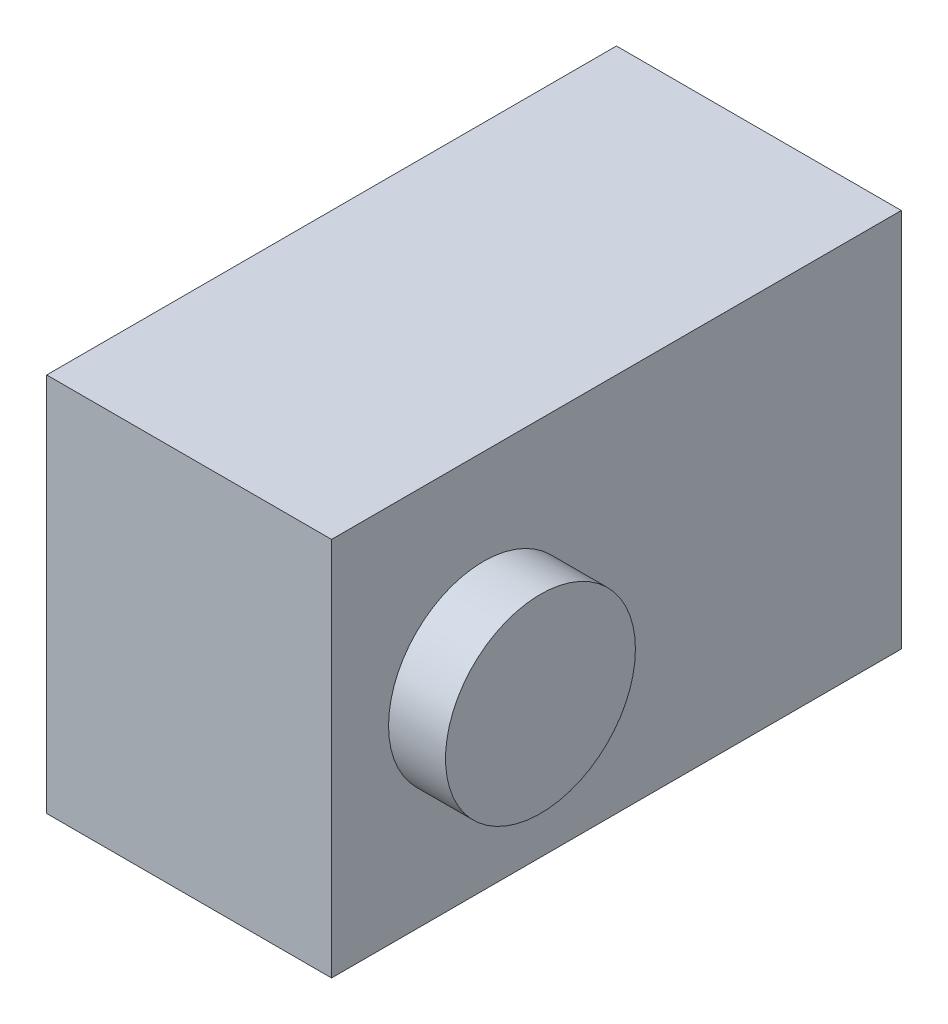
ISO-10303-21;
HEADER;
FILE_DESCRIPTION(('STEP AP214'),'2;1');
FILE_NAME('part.step','',(''),(''),'','','');
FILE_SCHEMA(('AUTOMOTIVE_DESIGN { 1 0 10303 214 1 1 1 1 }'));
ENDSEC;
DATA;
#1=APPLICATION_CONTEXT('core data for automotive mechanical design processes');
#2=APPLICATION_PROTOCOL_DEFINITION('international standard','automotive_design',2000,#1);
#3=PRODUCT_CONTEXT('',#1,'mechanical');
#4=PRODUCT('Part','Part','',(#3));
#5=PRODUCT_RELATED_PRODUCT_CATEGORY('part','',(#4));
#6=PRODUCT_DEFINITION_FORMATION('','',#4);
#7=PRODUCT_DEFINITION_CONTEXT('part definition',#1,'design');
#8=PRODUCT_DEFINITION('design','',#6,#7);
#9=PRODUCT_DEFINITION_SHAPE('','',#8);
#10=(LENGTH_UNIT() NAMED_UNIT(*) SI_UNIT(.MILLI.,.METRE.));
#11=(NAMED_UNIT(*) PLANE_ANGLE_UNIT() SI_UNIT($,.RADIAN.));
#12=(NAMED_UNIT(*) SI_UNIT($,.STERADIAN.) SOLID_ANGLE_UNIT());
#13=UNCERTAINTY_MEASURE_WITH_UNIT(LENGTH_MEASURE(1.E-05),#10,'distance_accuracy_value','');
#14=(GEOMETRIC_REPRESENTATION_CONTEXT(3) GLOBAL_UNCERTAINTY_ASSIGNED_CONTEXT((#13)) GLOBAL_UNIT_ASSIGNED_CONTEXT((#10,
#11,#12)) REPRESENTATION_CONTEXT('',''));
#15=CARTESIAN_POINT('',(0.,0.,0.));
#16=DIRECTION('',(0.,0.,1.));
#17=DIRECTION('',(1.,0.,0.));
#18=AXIS2_PLACEMENT_3D('',#15,#16,#17);
#19=CARTESIAN_POINT('',(3.,0.,30.));
#20=DIRECTION('',(1.,0.,0.));
#21=DIRECTION('',(0.,0.,-1.));
#22=AXIS2_PLACEMENT_3D('',#19,#20,#21);
#23=PLANE('',#22);
#24=CARTESIAN_POINT('',(3.,10.,22.));
#25=DIRECTION('',(1.,0.,0.));
#26=DIRECTION('',(0.,0.,-1.));
#27=AXIS2_PLACEMENT_3D('',#24,#25,#26);
#28=CIRCLE('',#27,5.);
#29=CARTESIAN_POINT('',(3.,10.,17.));
#30=VERTEX_POINT('',#29);
#31=EDGE_CURVE('E106',#30,#30,#28,.T.);
#32=ORIENTED_EDGE('',*,*,#31,.T.);
#33=EDGE_LOOP('',(#32));
#34=FACE_BOUND('',#33,.T.);
#35=DIRECTION('',(0.,-1.,0.));
#36=VECTOR('',#35,1.);
#37=CARTESIAN_POINT('',(3.,0.,0.));
#38=LINE('',#37,#36);
#39=CARTESIAN_POINT('',(3.,20.,0.));
#40=VERTEX_POINT('',#39);
#41=CARTESIAN_POINT('',(3.,0.,0.));
#42=VERTEX_POINT('',#41);
#43=EDGE_CURVE('E103',#40,#42,#38,.T.);
#44=ORIENTED_EDGE('',*,*,#43,.T.);
#45=DIRECTION('',(0.,0.,-1.));
#46=VECTOR('',#45,1.);
#47=CARTESIAN_POINT('',(3.,0.,30.));
#48=LINE('',#47,#46);
#49=CARTESIAN_POINT('',(3.,0.,30.));
#50=VERTEX_POINT('',#49);
#51=EDGE_CURVE('E11',#50,#42,#48,.T.);
#52=ORIENTED_EDGE('',*,*,#51,.F.);
#53=DIRECTION('',(0.,-1.,0.));
#54=VECTOR('',#53,1.);
#55=CARTESIAN_POINT('',(3.,0.,30.));
#56=LINE('',#55,#54);
#57=CARTESIAN_POINT('',(3.,20.,30.));
#58=VERTEX_POINT('',#57);
#59=EDGE_CURVE('E90',#58,#50,#56,.T.);
#60=ORIENTED_EDGE('',*,*,#59,.F.);
#61=DIRECTION('',(0.,0.,-1.));
#62=VECTOR('',#61,1.);
#63=CARTESIAN_POINT('',(3.,20.,30.));
#64=LINE('',#63,#62);
#65=EDGE_CURVE('E99',#58,#40,#64,.T.);
#66=ORIENTED_EDGE('',*,*,#65,.T.);
#67=EDGE_LOOP('',(#44,#52,#60,#66));
#68=FACE_BOUND('',#67,.T.);
#69=ADVANCED_FACE('F38',(#34,#68),#23,.F.);
#70=CARTESIAN_POINT('',(3.,0.,30.));
#71=DIRECTION('',(0.,1.,0.));
#72=DIRECTION('',(0.,0.,1.));
#73=AXIS2_PLACEMENT_3D('',#70,#71,#72);
#74=PLANE('',#73);
#75=DIRECTION('',(1.,0.,0.));
#76=VECTOR('',#75,1.);
#77=CARTESIAN_POINT('',(3.,0.,0.));
#78=LINE('',#77,#76);
#79=CARTESIAN_POINT('',(18.,0.,0.));
#80=VERTEX_POINT('',#79);
#81=EDGE_CURVE('E94',#42,#80,#78,.T.);
#82=ORIENTED_EDGE('',*,*,#81,.T.);
#83=DIRECTION('',(0.,0.,-1.));
#84=VECTOR('',#83,1.);
#85=CARTESIAN_POINT('',(18.,0.,30.));
#86=LINE('',#85,#84);
#87=CARTESIAN_POINT('',(18.,0.,30.));
#88=VERTEX_POINT('',#87);
#89=EDGE_CURVE('E47',#88,#80,#86,.T.);
#90=ORIENTED_EDGE('',*,*,#89,.F.);
#91=DIRECTION('',(1.,0.,0.));
#92=VECTOR('',#91,1.);
#93=CARTESIAN_POINT('',(3.,0.,30.));
#94=LINE('',#93,#92);
#95=EDGE_CURVE('E85',#50,#88,#94,.T.);
#96=ORIENTED_EDGE('',*,*,#95,.F.);
#97=ORIENTED_EDGE('',*,*,#51,.T.);
#98=EDGE_LOOP('',(#82,#90,#96,#97));
#99=FACE_BOUND('',#98,.T.);
#100=ADVANCED_FACE('F93',(#99),#74,.F.);
#101=CARTESIAN_POINT('',(18.,0.,30.));
#102=DIRECTION('',(-1.,0.,0.));
#103=DIRECTION('',(0.,0.,1.));
#104=AXIS2_PLACEMENT_3D('',#101,#102,#103);
#105=PLANE('',#104);
#106=CARTESIAN_POINT('',(18.,10.,22.));
#107=DIRECTION('',(-1.,0.,0.));
#108=DIRECTION('',(0.,0.,1.));
#109=AXIS2_PLACEMENT_3D('',#106,#107,#108);
#110=CIRCLE('',#109,5.);
#111=CARTESIAN_POINT('',(18.,10.,27.));
#112=VERTEX_POINT('',#111);
#113=EDGE_CURVE('E41',#112,#112,#110,.T.);
#114=ORIENTED_EDGE('',*,*,#113,.T.);
#115=EDGE_LOOP('',(#114));
#116=FACE_BOUND('',#115,.T.);
#117=DIRECTION('',(0.,1.,0.));
#118=VECTOR('',#117,1.);
#119=CARTESIAN_POINT('',(18.,0.,0.));
#120=LINE('',#119,#118);
#121=CARTESIAN_POINT('',(18.,20.,0.));
#122=VERTEX_POINT('',#121);
#123=EDGE_CURVE('E72',#80,#122,#120,.T.);
#124=ORIENTED_EDGE('',*,*,#123,.T.);
#125=DIRECTION('',(0.,0.,-1.));
#126=VECTOR('',#125,1.);
#127=CARTESIAN_POINT('',(18.,20.,30.));
#128=LINE('',#127,#126);
#129=CARTESIAN_POINT('',(18.,20.,30.));
#130=VERTEX_POINT('',#129);
#131=EDGE_CURVE('E95',#130,#122,#128,.T.);
#132=ORIENTED_EDGE('',*,*,#131,.F.);
#133=DIRECTION('',(0.,1.,0.));
#134=VECTOR('',#133,1.);
#135=CARTESIAN_POINT('',(18.,0.,30.));
#136=LINE('',#135,#134);
#137=EDGE_CURVE('E88',#88,#130,#136,.T.);
#138=ORIENTED_EDGE('',*,*,#137,.F.);
#139=ORIENTED_EDGE('',*,*,#89,.T.);
#140=EDGE_LOOP('',(#124,#132,#138,#139));
#141=FACE_BOUND('',#140,.T.);
#142=ADVANCED_FACE('F97',(#116,#141),#105,.F.);
#143=CARTESIAN_POINT('',(3.,20.,30.));
#144=DIRECTION('',(0.,-1.,0.));
#145=DIRECTION('',(0.,0.,-1.));
#146=AXIS2_PLACEMENT_3D('',#143,#144,#145);
#147=PLANE('',#146);
#148=DIRECTION('',(-1.,0.,0.));
#149=VECTOR('',#148,1.);
#150=CARTESIAN_POINT('',(3.,20.,0.));
#151=LINE('',#150,#149);
#152=EDGE_CURVE('E78',#122,#40,#151,.T.);
#153=ORIENTED_EDGE('',*,*,#152,.T.);
#154=ORIENTED_EDGE('',*,*,#65,.F.);
#155=DIRECTION('',(-1.,0.,0.));
#156=VECTOR('',#155,1.);
#157=CARTESIAN_POINT('',(3.,20.,30.));
#158=LINE('',#157,#156);
#159=EDGE_CURVE('E55',#130,#58,#158,.T.);
#160=ORIENTED_EDGE('',*,*,#159,.F.);
#161=ORIENTED_EDGE('',*,*,#131,.T.);
#162=EDGE_LOOP('',(#153,#154,#160,#161));
#163=FACE_BOUND('',#162,.T.);
#164=ADVANCED_FACE('F111',(#163),#147,.F.);
#165=CARTESIAN_POINT('',(3.,0.,30.));
#166=DIRECTION('',(0.,0.,-1.));
#167=DIRECTION('',(-1.,0.,0.));
#168=AXIS2_PLACEMENT_3D('',#165,#166,#167);
#169=PLANE('',#168);
#170=ORIENTED_EDGE('',*,*,#59,.T.);
#171=ORIENTED_EDGE('',*,*,#95,.T.);
#172=ORIENTED_EDGE('',*,*,#137,.T.);
#173=ORIENTED_EDGE('',*,*,#159,.T.);
#174=EDGE_LOOP('',(#170,#171,#172,#173));
#175=FACE_BOUND('',#174,.T.);
#176=ADVANCED_FACE('F86',(#175),#169,.F.);
#177=CARTESIAN_POINT('',(3.,0.,0.));
#178=DIRECTION('',(0.,0.,-1.));
#179=DIRECTION('',(-1.,0.,0.));
#180=AXIS2_PLACEMENT_3D('',#177,#178,#179);
#181=PLANE('',#180);
#182=ORIENTED_EDGE('',*,*,#43,.F.);
#183=ORIENTED_EDGE('',*,*,#152,.F.);
#184=ORIENTED_EDGE('',*,*,#123,.F.);
#185=ORIENTED_EDGE('',*,*,#81,.F.);
#186=EDGE_LOOP('',(#182,#183,#184,#185));
#187=FACE_BOUND('',#186,.T.);
#188=ADVANCED_FACE('F114',(#187),#181,.T.);
#189=CARTESIAN_POINT('',(21.,10.,22.));
#190=DIRECTION('',(1.,0.,0.));
#191=DIRECTION('',(0.,0.,-1.));
#192=AXIS2_PLACEMENT_3D('',#189,#190,#191);
#193=PLANE('',#192);
#194=CARTESIAN_POINT('',(21.,10.,22.));
#195=DIRECTION('',(1.,0.,0.));
#196=DIRECTION('',(0.,0.,-1.));
#197=AXIS2_PLACEMENT_3D('',#194,#195,#196);
#198=CIRCLE('',#197,5.);
#199=CARTESIAN_POINT('',(21.,10.,17.));
#200=VERTEX_POINT('',#199);
#201=EDGE_CURVE('E122',#200,#200,#198,.T.);
#202=ORIENTED_EDGE('',*,*,#201,.T.);
#203=EDGE_LOOP('',(#202));
#204=FACE_BOUND('',#203,.T.);
#205=ADVANCED_FACE('F126',(#204),#193,.T.);
#206=CARTESIAN_POINT('',(0.,10.,22.));
#207=DIRECTION('',(1.,0.,0.));
#208=DIRECTION('',(0.,0.,-1.));
#209=AXIS2_PLACEMENT_3D('',#206,#207,#208);
#210=CYLINDRICAL_SURFACE('',#209,5.);
#211=ORIENTED_EDGE('',*,*,#201,.F.);
#212=EDGE_LOOP('',(#211));
#213=FACE_BOUND('',#212,.T.);
#214=ORIENTED_EDGE('',*,*,#113,.F.);
#215=EDGE_LOOP('',(#214));
#216=FACE_BOUND('',#215,.T.);
#217=ADVANCED_FACE('F128',(#213,#216),#210,.T.);
#218=CARTESIAN_POINT('',(0.,10.,22.));
#219=DIRECTION('',(1.,0.,0.));
#220=DIRECTION('',(0.,0.,-1.));
#221=AXIS2_PLACEMENT_3D('',#218,#219,#220);
#222=CIRCLE('',#221,5.);
#223=CARTESIAN_POINT('',(0.,10.,17.));
#224=VERTEX_POINT('',#223);
#225=EDGE_CURVE('E119',#224,#224,#222,.T.);
#226=ORIENTED_EDGE('',*,*,#225,.T.);
#227=EDGE_LOOP('',(#226));
#228=FACE_BOUND('',#227,.T.);
#229=ORIENTED_EDGE('',*,*,#31,.F.);
#230=EDGE_LOOP('',(#229));
#231=FACE_BOUND('',#230,.T.);
#232=ADVANCED_FACE('F131',(#228,#231),#210,.T.);
#233=CARTESIAN_POINT('',(0.,10.,22.));
#234=DIRECTION('',(1.,0.,0.));
#235=DIRECTION('',(0.,0.,-1.));
#236=AXIS2_PLACEMENT_3D('',#233,#234,#235);
#237=PLANE('',#236);
#238=ORIENTED_EDGE('',*,*,#225,.F.);
#239=EDGE_LOOP('',(#238));
#240=FACE_BOUND('',#239,.T.);
#241=ADVANCED_FACE('F150',(#240),#237,.F.);
#242=CLOSED_SHELL('',(#69,#100,#142,#164,#176,#188,#205,#217,#232,#241));
#243=MANIFOLD_SOLID_BREP('B2',#242);
#244=ADVANCED_BREP_SHAPE_REPRESENTATION('',(#18,#243),#14);
#245=SHAPE_DEFINITION_REPRESENTATION(#9,#244);
ENDSEC;
END-ISO-10303-21;
